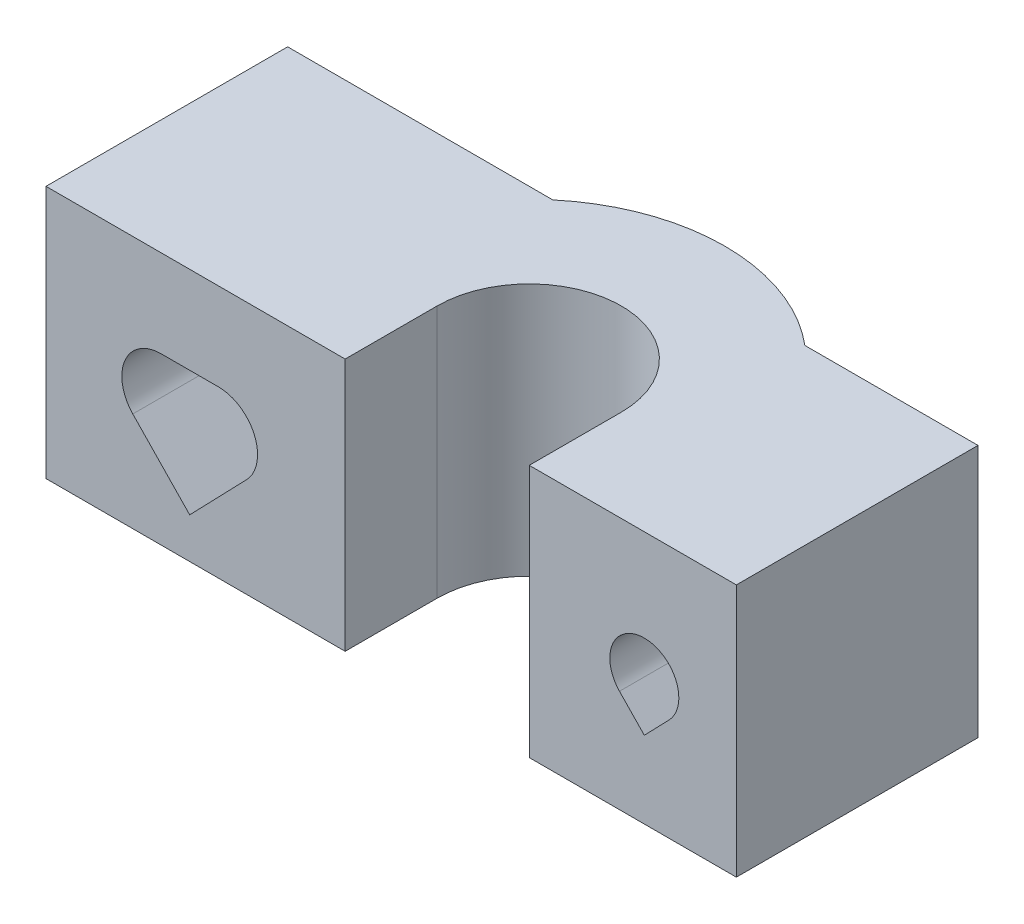
ISO-10303-21;
HEADER;
FILE_DESCRIPTION(('STEP AP214'),'2;1');
FILE_NAME('part.step','',(''),(''),'','','');
FILE_SCHEMA(('AUTOMOTIVE_DESIGN { 1 0 10303 214 1 1 1 1 }'));
ENDSEC;
DATA;
#1=APPLICATION_CONTEXT('core data for automotive mechanical design processes');
#2=APPLICATION_PROTOCOL_DEFINITION('international standard','automotive_design',2000,#1);
#3=PRODUCT_CONTEXT('',#1,'mechanical');
#4=PRODUCT('Part','Part','',(#3));
#5=PRODUCT_RELATED_PRODUCT_CATEGORY('part','',(#4));
#6=PRODUCT_DEFINITION_FORMATION('','',#4);
#7=PRODUCT_DEFINITION_CONTEXT('part definition',#1,'design');
#8=PRODUCT_DEFINITION('design','',#6,#7);
#9=PRODUCT_DEFINITION_SHAPE('','',#8);
#10=(LENGTH_UNIT() NAMED_UNIT(*) SI_UNIT(.MILLI.,.METRE.));
#11=(NAMED_UNIT(*) PLANE_ANGLE_UNIT() SI_UNIT($,.RADIAN.));
#12=(NAMED_UNIT(*) SI_UNIT($,.STERADIAN.) SOLID_ANGLE_UNIT());
#13=UNCERTAINTY_MEASURE_WITH_UNIT(LENGTH_MEASURE(1.E-05),#10,'distance_accuracy_value','');
#14=(GEOMETRIC_REPRESENTATION_CONTEXT(3) GLOBAL_UNCERTAINTY_ASSIGNED_CONTEXT((#13)) GLOBAL_UNIT_ASSIGNED_CONTEXT((#10,
#11,#12)) REPRESENTATION_CONTEXT('',''));
#15=CARTESIAN_POINT('',(0.,0.,0.));
#16=DIRECTION('',(0.,0.,1.));
#17=DIRECTION('',(1.,0.,0.));
#18=AXIS2_PLACEMENT_3D('',#15,#16,#17);
#19=CARTESIAN_POINT('',(9.99999999999999,0.,0.));
#20=DIRECTION('',(0.,0.,1.));
#21=DIRECTION('',(1.,0.,0.));
#22=AXIS2_PLACEMENT_3D('',#19,#20,#21);
#23=PLANE('',#22);
#24=CARTESIAN_POINT('',(36.,5.50000000000001,0.));
#25=DIRECTION('',(0.,0.,1.));
#26=DIRECTION('',(1.,0.,0.));
#27=AXIS2_PLACEMENT_3D('',#24,#25,#26);
#28=CIRCLE('',#27,1.5);
#29=CARTESIAN_POINT('',(37.079009700508,4.45801244431151,0.));
#30=VERTEX_POINT('',#29);
#31=CARTESIAN_POINT('',(34.920990299492,4.45801244431151,0.));
#32=VERTEX_POINT('',#31);
#33=EDGE_CURVE('E194',#30,#32,#28,.T.);
#34=ORIENTED_EDGE('',*,*,#33,.F.);
#35=DIRECTION('',(0.694658370458997,0.719339800338651,0.));
#36=VECTOR('',#35,1.);
#37=CARTESIAN_POINT('',(36.,3.34066519056142,0.));
#38=LINE('',#37,#36);
#39=CARTESIAN_POINT('',(36.,3.34066519056142,0.));
#40=VERTEX_POINT('',#39);
#41=EDGE_CURVE('E204',#40,#30,#38,.T.);
#42=ORIENTED_EDGE('',*,*,#41,.F.);
#43=DIRECTION('',(0.694658370458997,-0.719339800338651,0.));
#44=VECTOR('',#43,1.);
#45=CARTESIAN_POINT('',(34.920990299492,4.45801244431151,0.));
#46=LINE('',#45,#44);
#47=EDGE_CURVE('E201',#32,#40,#46,.T.);
#48=ORIENTED_EDGE('',*,*,#47,.F.);
#49=EDGE_LOOP('',(#34,#42,#48));
#50=FACE_BOUND('',#49,.T.);
#51=DIRECTION('',(0.,-1.,0.));
#52=VECTOR('',#51,1.);
#53=CARTESIAN_POINT('',(31.0000000000001,11.,0.));
#54=LINE('',#53,#52);
#55=CARTESIAN_POINT('',(31.0000000000001,11.,0.));
#56=VERTEX_POINT('',#55);
#57=CARTESIAN_POINT('',(31.0000000000001,0.,0.));
#58=VERTEX_POINT('',#57);
#59=EDGE_CURVE('E225',#56,#58,#54,.T.);
#60=ORIENTED_EDGE('',*,*,#59,.T.);
#61=DIRECTION('',(1.,0.,0.));
#62=VECTOR('',#61,1.);
#63=CARTESIAN_POINT('',(9.99999999999999,0.,0.));
#64=LINE('',#63,#62);
#65=CARTESIAN_POINT('',(40.,0.,0.));
#66=VERTEX_POINT('',#65);
#67=EDGE_CURVE('E244',#58,#66,#64,.T.);
#68=ORIENTED_EDGE('',*,*,#67,.T.);
#69=DIRECTION('',(0.,1.,0.));
#70=VECTOR('',#69,1.);
#71=CARTESIAN_POINT('',(40.,0.,0.));
#72=LINE('',#71,#70);
#73=CARTESIAN_POINT('',(40.,11.,0.));
#74=VERTEX_POINT('',#73);
#75=EDGE_CURVE('E288',#66,#74,#72,.T.);
#76=ORIENTED_EDGE('',*,*,#75,.T.);
#77=DIRECTION('',(1.,0.,0.));
#78=VECTOR('',#77,1.);
#79=CARTESIAN_POINT('',(9.99999999999999,11.,0.));
#80=LINE('',#79,#78);
#81=EDGE_CURVE('E264',#56,#74,#80,.T.);
#82=ORIENTED_EDGE('',*,*,#81,.F.);
#83=EDGE_LOOP('',(#60,#68,#76,#82));
#84=FACE_BOUND('',#83,.T.);
#85=ADVANCED_FACE('F31',(#50,#84),#23,.T.);
#86=CARTESIAN_POINT('',(9.99999999999999,0.,-10.5));
#87=DIRECTION('',(-1.,0.,0.));
#88=DIRECTION('',(0.,0.,1.));
#89=AXIS2_PLACEMENT_3D('',#86,#87,#88);
#90=PLANE('',#89);
#91=DIRECTION('',(0.,0.,1.));
#92=VECTOR('',#91,1.);
#93=CARTESIAN_POINT('',(9.99999999999999,11.,-10.5));
#94=LINE('',#93,#92);
#95=CARTESIAN_POINT('',(9.99999999999999,11.,-10.5));
#96=VERTEX_POINT('',#95);
#97=CARTESIAN_POINT('',(9.99999999999999,11.,0.));
#98=VERTEX_POINT('',#97);
#99=EDGE_CURVE('E234',#96,#98,#94,.T.);
#100=ORIENTED_EDGE('',*,*,#99,.F.);
#101=DIRECTION('',(0.,1.,0.));
#102=VECTOR('',#101,1.);
#103=CARTESIAN_POINT('',(9.99999999999999,0.,-10.5));
#104=LINE('',#103,#102);
#105=CARTESIAN_POINT('',(9.99999999999999,0.,-10.5));
#106=VERTEX_POINT('',#105);
#107=EDGE_CURVE('E279',#106,#96,#104,.T.);
#108=ORIENTED_EDGE('',*,*,#107,.F.);
#109=DIRECTION('',(0.,0.,1.));
#110=VECTOR('',#109,1.);
#111=CARTESIAN_POINT('',(9.99999999999999,0.,-10.5));
#112=LINE('',#111,#110);
#113=CARTESIAN_POINT('',(9.99999999999999,0.,0.));
#114=VERTEX_POINT('',#113);
#115=EDGE_CURVE('E241',#106,#114,#112,.T.);
#116=ORIENTED_EDGE('',*,*,#115,.T.);
#117=DIRECTION('',(0.,1.,0.));
#118=VECTOR('',#117,1.);
#119=CARTESIAN_POINT('',(9.99999999999999,0.,0.));
#120=LINE('',#119,#118);
#121=EDGE_CURVE('E261',#114,#98,#120,.T.);
#122=ORIENTED_EDGE('',*,*,#121,.T.);
#123=EDGE_LOOP('',(#100,#108,#116,#122));
#124=FACE_BOUND('',#123,.T.);
#125=ADVANCED_FACE('F33',(#124),#90,.T.);
#126=CARTESIAN_POINT('',(21.5227744249484,0.,-10.5));
#127=DIRECTION('',(0.,0.,-1.));
#128=DIRECTION('',(-1.,0.,0.));
#129=AXIS2_PLACEMENT_3D('',#126,#127,#128);
#130=PLANE('',#129);
#131=DIRECTION('',(-0.694658370458997,-0.719339800338651,0.));
#132=VECTOR('',#131,1.);
#133=CARTESIAN_POINT('',(18.7171388933383,4.31908077021971,-10.5));
#134=LINE('',#133,#132);
#135=CARTESIAN_POINT('',(18.7171388933383,4.31908077021971,-10.5));
#136=VERTEX_POINT('',#135);
#137=CARTESIAN_POINT('',(16.2442612327626,1.75834099039807,-10.5));
#138=VERTEX_POINT('',#137);
#139=EDGE_CURVE('E46',#136,#138,#134,.T.);
#140=ORIENTED_EDGE('',*,*,#139,.F.);
#141=CARTESIAN_POINT('',(17.4942612327626,5.50000000000001,-10.5));
#142=DIRECTION('',(0.,0.,-1.));
#143=DIRECTION('',(-1.,0.,0.));
#144=AXIS2_PLACEMENT_3D('',#141,#142,#143);
#145=CIRCLE('',#144,1.7);
#146=CARTESIAN_POINT('',(17.4942612327626,7.2,-10.5));
#147=VERTEX_POINT('',#146);
#148=EDGE_CURVE('E174',#147,#136,#145,.T.);
#149=ORIENTED_EDGE('',*,*,#148,.F.);
#150=DIRECTION('',(1.,0.,0.));
#151=VECTOR('',#150,1.);
#152=CARTESIAN_POINT('',(14.9942612327626,7.2,-10.5));
#153=LINE('',#152,#151);
#154=CARTESIAN_POINT('',(14.9942612327626,7.2,-10.5));
#155=VERTEX_POINT('',#154);
#156=EDGE_CURVE('E177',#155,#147,#153,.T.);
#157=ORIENTED_EDGE('',*,*,#156,.F.);
#158=CARTESIAN_POINT('',(14.9942612327626,5.50000000000001,-10.5));
#159=DIRECTION('',(0.,0.,-1.));
#160=DIRECTION('',(-1.,0.,0.));
#161=AXIS2_PLACEMENT_3D('',#158,#159,#160);
#162=CIRCLE('',#161,1.7);
#163=CARTESIAN_POINT('',(13.7713835721869,4.31908077021971,-10.5));
#164=VERTEX_POINT('',#163);
#165=EDGE_CURVE('E187',#164,#155,#162,.T.);
#166=ORIENTED_EDGE('',*,*,#165,.F.);
#167=DIRECTION('',(-0.694658370458997,0.719339800338651,0.));
#168=VECTOR('',#167,1.);
#169=CARTESIAN_POINT('',(16.2442612327626,1.75834099039807,-10.5));
#170=LINE('',#169,#168);
#171=EDGE_CURVE('E185',#138,#164,#170,.T.);
#172=ORIENTED_EDGE('',*,*,#171,.F.);
#173=EDGE_LOOP('',(#140,#149,#157,#166,#172));
#174=FACE_BOUND('',#173,.T.);
#175=DIRECTION('',(-1.,0.,0.));
#176=VECTOR('',#175,1.);
#177=CARTESIAN_POINT('',(21.5227744249484,11.,-10.5));
#178=LINE('',#177,#176);
#179=CARTESIAN_POINT('',(21.5227744249484,11.,-10.5));
#180=VERTEX_POINT('',#179);
#181=EDGE_CURVE('E245',#180,#96,#178,.T.);
#182=ORIENTED_EDGE('',*,*,#181,.F.);
#183=DIRECTION('',(0.,1.,0.));
#184=VECTOR('',#183,1.);
#185=CARTESIAN_POINT('',(21.5227744249484,0.,-10.5));
#186=LINE('',#185,#184);
#187=CARTESIAN_POINT('',(21.5227744249484,0.,-10.5));
#188=VERTEX_POINT('',#187);
#189=EDGE_CURVE('E282',#188,#180,#186,.T.);
#190=ORIENTED_EDGE('',*,*,#189,.F.);
#191=DIRECTION('',(-1.,0.,0.));
#192=VECTOR('',#191,1.);
#193=CARTESIAN_POINT('',(21.5227744249484,0.,-10.5));
#194=LINE('',#193,#192);
#195=EDGE_CURVE('E258',#188,#106,#194,.T.);
#196=ORIENTED_EDGE('',*,*,#195,.T.);
#197=ORIENTED_EDGE('',*,*,#107,.T.);
#198=EDGE_LOOP('',(#182,#190,#196,#197));
#199=FACE_BOUND('',#198,.T.);
#200=ADVANCED_FACE('F346',(#174,#199),#130,.T.);
#201=CARTESIAN_POINT('',(27.0000000000001,0.,-4.));
#202=DIRECTION('',(0.,1.,0.));
#203=DIRECTION('',(0.,0.,1.));
#204=AXIS2_PLACEMENT_3D('',#201,#202,#203);
#205=CYLINDRICAL_SURFACE('',#204,8.50000000000001);
#206=CARTESIAN_POINT('',(27.0000000000001,11.,-4.));
#207=DIRECTION('',(0.,1.,0.));
#208=DIRECTION('',(0.,0.,1.));
#209=AXIS2_PLACEMENT_3D('',#206,#207,#208);
#210=CIRCLE('',#209,8.50000000000001);
#211=CARTESIAN_POINT('',(32.4772255750518,11.,-10.5));
#212=VERTEX_POINT('',#211);
#213=EDGE_CURVE('E274',#212,#180,#210,.T.);
#214=ORIENTED_EDGE('',*,*,#213,.F.);
#215=DIRECTION('',(0.,1.,0.));
#216=VECTOR('',#215,1.);
#217=CARTESIAN_POINT('',(32.4772255750518,0.,-10.5));
#218=LINE('',#217,#216);
#219=CARTESIAN_POINT('',(32.4772255750518,0.,-10.5));
#220=VERTEX_POINT('',#219);
#221=EDGE_CURVE('E284',#220,#212,#218,.T.);
#222=ORIENTED_EDGE('',*,*,#221,.F.);
#223=CARTESIAN_POINT('',(27.0000000000001,0.,-4.));
#224=DIRECTION('',(0.,1.,0.));
#225=DIRECTION('',(0.,0.,1.));
#226=AXIS2_PLACEMENT_3D('',#223,#224,#225);
#227=CIRCLE('',#226,8.50000000000001);
#228=EDGE_CURVE('E255',#220,#188,#227,.T.);
#229=ORIENTED_EDGE('',*,*,#228,.T.);
#230=ORIENTED_EDGE('',*,*,#189,.T.);
#231=EDGE_LOOP('',(#214,#222,#229,#230));
#232=FACE_BOUND('',#231,.T.);
#233=ADVANCED_FACE('F349',(#232),#205,.T.);
#234=CARTESIAN_POINT('',(40.,0.,-10.5));
#235=DIRECTION('',(0.,0.,-1.));
#236=DIRECTION('',(-1.,0.,0.));
#237=AXIS2_PLACEMENT_3D('',#234,#235,#236);
#238=PLANE('',#237);
#239=CARTESIAN_POINT('',(36.,5.50000000000001,-10.5));
#240=DIRECTION('',(0.,0.,-1.));
#241=DIRECTION('',(-1.,0.,0.));
#242=AXIS2_PLACEMENT_3D('',#239,#240,#241);
#243=CIRCLE('',#242,1.5);
#244=CARTESIAN_POINT('',(34.920990299492,4.45801244431151,-10.5));
#245=VERTEX_POINT('',#244);
#246=CARTESIAN_POINT('',(37.079009700508,4.45801244431151,-10.5));
#247=VERTEX_POINT('',#246);
#248=EDGE_CURVE('E11',#245,#247,#243,.T.);
#249=ORIENTED_EDGE('',*,*,#248,.F.);
#250=DIRECTION('',(-0.694658370458997,0.719339800338651,0.));
#251=VECTOR('',#250,1.);
#252=CARTESIAN_POINT('',(39.5995160803895,-0.386742825658563,-10.5));
#253=LINE('',#252,#251);
#254=CARTESIAN_POINT('',(36.,3.34066519056142,-10.5));
#255=VERTEX_POINT('',#254);
#256=EDGE_CURVE('E281',#255,#245,#253,.T.);
#257=ORIENTED_EDGE('',*,*,#256,.F.);
#258=DIRECTION('',(-0.694658370458997,-0.719339800338651,0.));
#259=VECTOR('',#258,1.);
#260=CARTESIAN_POINT('',(36.2608859328005,3.61082048241782,-10.5));
#261=LINE('',#260,#259);
#262=EDGE_CURVE('E39',#247,#255,#261,.T.);
#263=ORIENTED_EDGE('',*,*,#262,.F.);
#264=EDGE_LOOP('',(#249,#257,#263));
#265=FACE_BOUND('',#264,.T.);
#266=DIRECTION('',(-1.,0.,0.));
#267=VECTOR('',#266,1.);
#268=CARTESIAN_POINT('',(40.,11.,-10.5));
#269=LINE('',#268,#267);
#270=CARTESIAN_POINT('',(40.,11.,-10.5));
#271=VERTEX_POINT('',#270);
#272=EDGE_CURVE('E271',#271,#212,#269,.T.);
#273=ORIENTED_EDGE('',*,*,#272,.F.);
#274=DIRECTION('',(0.,1.,0.));
#275=VECTOR('',#274,1.);
#276=CARTESIAN_POINT('',(40.,0.,-10.5));
#277=LINE('',#276,#275);
#278=CARTESIAN_POINT('',(40.,0.,-10.5));
#279=VERTEX_POINT('',#278);
#280=EDGE_CURVE('E286',#279,#271,#277,.T.);
#281=ORIENTED_EDGE('',*,*,#280,.F.);
#282=DIRECTION('',(-1.,0.,0.));
#283=VECTOR('',#282,1.);
#284=CARTESIAN_POINT('',(40.,0.,-10.5));
#285=LINE('',#284,#283);
#286=EDGE_CURVE('E252',#279,#220,#285,.T.);
#287=ORIENTED_EDGE('',*,*,#286,.T.);
#288=ORIENTED_EDGE('',*,*,#221,.T.);
#289=EDGE_LOOP('',(#273,#281,#287,#288));
#290=FACE_BOUND('',#289,.T.);
#291=ADVANCED_FACE('F300',(#265,#290),#238,.T.);
#292=CARTESIAN_POINT('',(40.,0.,0.));
#293=DIRECTION('',(1.,0.,0.));
#294=DIRECTION('',(0.,0.,-1.));
#295=AXIS2_PLACEMENT_3D('',#292,#293,#294);
#296=PLANE('',#295);
#297=DIRECTION('',(0.,0.,-1.));
#298=VECTOR('',#297,1.);
#299=CARTESIAN_POINT('',(40.,11.,0.));
#300=LINE('',#299,#298);
#301=EDGE_CURVE('E268',#74,#271,#300,.T.);
#302=ORIENTED_EDGE('',*,*,#301,.F.);
#303=ORIENTED_EDGE('',*,*,#75,.F.);
#304=DIRECTION('',(0.,0.,-1.));
#305=VECTOR('',#304,1.);
#306=CARTESIAN_POINT('',(40.,0.,0.));
#307=LINE('',#306,#305);
#308=EDGE_CURVE('E249',#66,#279,#307,.T.);
#309=ORIENTED_EDGE('',*,*,#308,.T.);
#310=ORIENTED_EDGE('',*,*,#280,.T.);
#311=EDGE_LOOP('',(#302,#303,#309,#310));
#312=FACE_BOUND('',#311,.T.);
#313=ADVANCED_FACE('F327',(#312),#296,.T.);
#314=DIRECTION('',(-0.694658370458997,-0.719339800338651,0.));
#315=VECTOR('',#314,1.);
#316=CARTESIAN_POINT('',(18.7171388933383,4.31908077021971,0.));
#317=LINE('',#316,#315);
#318=CARTESIAN_POINT('',(18.7171388933383,4.31908077021971,0.));
#319=VERTEX_POINT('',#318);
#320=CARTESIAN_POINT('',(16.2442612327626,1.75834099039807,0.));
#321=VERTEX_POINT('',#320);
#322=EDGE_CURVE('E157',#319,#321,#317,.T.);
#323=ORIENTED_EDGE('',*,*,#322,.T.);
#324=DIRECTION('',(-0.694658370458997,0.719339800338651,0.));
#325=VECTOR('',#324,1.);
#326=CARTESIAN_POINT('',(16.2442612327626,1.75834099039807,0.));
#327=LINE('',#326,#325);
#328=CARTESIAN_POINT('',(13.7713835721869,4.31908077021971,0.));
#329=VERTEX_POINT('',#328);
#330=EDGE_CURVE('E166',#321,#329,#327,.T.);
#331=ORIENTED_EDGE('',*,*,#330,.T.);
#332=CARTESIAN_POINT('',(14.9942612327626,5.50000000000001,0.));
#333=DIRECTION('',(0.,0.,-1.));
#334=DIRECTION('',(-1.,0.,0.));
#335=AXIS2_PLACEMENT_3D('',#332,#333,#334);
#336=CIRCLE('',#335,1.7);
#337=CARTESIAN_POINT('',(14.9942612327626,7.2,0.));
#338=VERTEX_POINT('',#337);
#339=EDGE_CURVE('E54',#329,#338,#336,.T.);
#340=ORIENTED_EDGE('',*,*,#339,.T.);
#341=DIRECTION('',(1.,0.,0.));
#342=VECTOR('',#341,1.);
#343=CARTESIAN_POINT('',(14.9942612327626,7.2,0.));
#344=LINE('',#343,#342);
#345=CARTESIAN_POINT('',(17.4942612327626,7.2,0.));
#346=VERTEX_POINT('',#345);
#347=EDGE_CURVE('E181',#338,#346,#344,.T.);
#348=ORIENTED_EDGE('',*,*,#347,.T.);
#349=CARTESIAN_POINT('',(17.4942612327626,5.50000000000001,0.));
#350=DIRECTION('',(0.,0.,-1.));
#351=DIRECTION('',(-1.,0.,0.));
#352=AXIS2_PLACEMENT_3D('',#349,#350,#351);
#353=CIRCLE('',#352,1.7);
#354=EDGE_CURVE('E163',#346,#319,#353,.T.);
#355=ORIENTED_EDGE('',*,*,#354,.T.);
#356=EDGE_LOOP('',(#323,#331,#340,#348,#355));
#357=FACE_BOUND('',#356,.T.);
#358=DIRECTION('',(0.,-1.,0.));
#359=VECTOR('',#358,1.);
#360=CARTESIAN_POINT('',(23.0000000000001,11.,0.));
#361=LINE('',#360,#359);
#362=CARTESIAN_POINT('',(23.0000000000001,11.,0.));
#363=VERTEX_POINT('',#362);
#364=CARTESIAN_POINT('',(23.0000000000001,0.,0.));
#365=VERTEX_POINT('',#364);
#366=EDGE_CURVE('E237',#363,#365,#361,.T.);
#367=ORIENTED_EDGE('',*,*,#366,.F.);
#368=EDGE_CURVE('E265',#98,#363,#80,.T.);
#369=ORIENTED_EDGE('',*,*,#368,.F.);
#370=ORIENTED_EDGE('',*,*,#121,.F.);
#371=EDGE_CURVE('E246',#114,#365,#64,.T.);
#372=ORIENTED_EDGE('',*,*,#371,.T.);
#373=EDGE_LOOP('',(#367,#369,#370,#372));
#374=FACE_BOUND('',#373,.T.);
#375=ADVANCED_FACE('F170',(#357,#374),#23,.T.);
#376=CARTESIAN_POINT('',(27.0000000000001,0.,-4.));
#377=DIRECTION('',(0.,1.,0.));
#378=DIRECTION('',(0.,0.,1.));
#379=AXIS2_PLACEMENT_3D('',#376,#377,#378);
#380=PLANE('',#379);
#381=ORIENTED_EDGE('',*,*,#67,.F.);
#382=DIRECTION('',(0.,0.,1.));
#383=VECTOR('',#382,1.);
#384=CARTESIAN_POINT('',(31.0000000000001,0.,-4.));
#385=LINE('',#384,#383);
#386=CARTESIAN_POINT('',(31.0000000000001,0.,-4.));
#387=VERTEX_POINT('',#386);
#388=EDGE_CURVE('E210',#387,#58,#385,.T.);
#389=ORIENTED_EDGE('',*,*,#388,.F.);
#390=CARTESIAN_POINT('',(27.0000000000001,0.,-4.));
#391=DIRECTION('',(0.,-1.,0.));
#392=DIRECTION('',(0.,0.,-1.));
#393=AXIS2_PLACEMENT_3D('',#390,#391,#392);
#394=CIRCLE('',#393,4.);
#395=CARTESIAN_POINT('',(23.0000000000001,0.,-4.));
#396=VERTEX_POINT('',#395);
#397=EDGE_CURVE('E219',#396,#387,#394,.T.);
#398=ORIENTED_EDGE('',*,*,#397,.F.);
#399=DIRECTION('',(0.,0.,-1.));
#400=VECTOR('',#399,1.);
#401=CARTESIAN_POINT('',(23.0000000000001,0.,0.));
#402=LINE('',#401,#400);
#403=EDGE_CURVE('E227',#365,#396,#402,.T.);
#404=ORIENTED_EDGE('',*,*,#403,.F.);
#405=ORIENTED_EDGE('',*,*,#371,.F.);
#406=ORIENTED_EDGE('',*,*,#115,.F.);
#407=ORIENTED_EDGE('',*,*,#195,.F.);
#408=ORIENTED_EDGE('',*,*,#228,.F.);
#409=ORIENTED_EDGE('',*,*,#286,.F.);
#410=ORIENTED_EDGE('',*,*,#308,.F.);
#411=EDGE_LOOP('',(#381,#389,#398,#404,#405,#406,#407,#408,#409,#410));
#412=FACE_BOUND('',#411,.T.);
#413=ADVANCED_FACE('F321',(#412),#380,.F.);
#414=CARTESIAN_POINT('',(27.0000000000001,11.,-4.));
#415=DIRECTION('',(0.,1.,0.));
#416=DIRECTION('',(0.,0.,1.));
#417=AXIS2_PLACEMENT_3D('',#414,#415,#416);
#418=PLANE('',#417);
#419=DIRECTION('',(0.,0.,1.));
#420=VECTOR('',#419,1.);
#421=CARTESIAN_POINT('',(31.0000000000001,11.,-4.));
#422=LINE('',#421,#420);
#423=CARTESIAN_POINT('',(31.0000000000001,11.,-4.));
#424=VERTEX_POINT('',#423);
#425=EDGE_CURVE('E215',#424,#56,#422,.T.);
#426=ORIENTED_EDGE('',*,*,#425,.T.);
#427=ORIENTED_EDGE('',*,*,#81,.T.);
#428=ORIENTED_EDGE('',*,*,#301,.T.);
#429=ORIENTED_EDGE('',*,*,#272,.T.);
#430=ORIENTED_EDGE('',*,*,#213,.T.);
#431=ORIENTED_EDGE('',*,*,#181,.T.);
#432=ORIENTED_EDGE('',*,*,#99,.T.);
#433=ORIENTED_EDGE('',*,*,#368,.T.);
#434=DIRECTION('',(0.,0.,-1.));
#435=VECTOR('',#434,1.);
#436=CARTESIAN_POINT('',(23.0000000000001,11.,0.));
#437=LINE('',#436,#435);
#438=CARTESIAN_POINT('',(23.0000000000001,11.,-4.));
#439=VERTEX_POINT('',#438);
#440=EDGE_CURVE('E218',#363,#439,#437,.T.);
#441=ORIENTED_EDGE('',*,*,#440,.T.);
#442=CARTESIAN_POINT('',(27.0000000000001,11.,-4.));
#443=DIRECTION('',(0.,-1.,0.));
#444=DIRECTION('',(0.,0.,-1.));
#445=AXIS2_PLACEMENT_3D('',#442,#443,#444);
#446=CIRCLE('',#445,4.);
#447=EDGE_CURVE('E222',#439,#424,#446,.T.);
#448=ORIENTED_EDGE('',*,*,#447,.T.);
#449=EDGE_LOOP('',(#426,#427,#428,#429,#430,#431,#432,#433,#441,#448));
#450=FACE_BOUND('',#449,.T.);
#451=ADVANCED_FACE('F330',(#450),#418,.T.);
#452=CARTESIAN_POINT('',(31.0000000000001,11.,-4.));
#453=DIRECTION('',(1.,0.,0.));
#454=DIRECTION('',(0.,0.,-1.));
#455=AXIS2_PLACEMENT_3D('',#452,#453,#454);
#456=PLANE('',#455);
#457=ORIENTED_EDGE('',*,*,#388,.T.);
#458=ORIENTED_EDGE('',*,*,#59,.F.);
#459=ORIENTED_EDGE('',*,*,#425,.F.);
#460=DIRECTION('',(0.,-1.,0.));
#461=VECTOR('',#460,1.);
#462=CARTESIAN_POINT('',(31.0000000000001,11.,-4.));
#463=LINE('',#462,#461);
#464=EDGE_CURVE('E232',#424,#387,#463,.T.);
#465=ORIENTED_EDGE('',*,*,#464,.T.);
#466=EDGE_LOOP('',(#457,#458,#459,#465));
#467=FACE_BOUND('',#466,.T.);
#468=ADVANCED_FACE('F331',(#467),#456,.F.);
#469=CARTESIAN_POINT('',(27.0000000000001,11.,-4.));
#470=DIRECTION('',(0.,-1.,0.));
#471=DIRECTION('',(0.,0.,-1.));
#472=AXIS2_PLACEMENT_3D('',#469,#470,#471);
#473=CYLINDRICAL_SURFACE('',#472,4.);
#474=ORIENTED_EDGE('',*,*,#397,.T.);
#475=ORIENTED_EDGE('',*,*,#464,.F.);
#476=ORIENTED_EDGE('',*,*,#447,.F.);
#477=DIRECTION('',(0.,-1.,0.));
#478=VECTOR('',#477,1.);
#479=CARTESIAN_POINT('',(23.0000000000001,11.,-4.));
#480=LINE('',#479,#478);
#481=EDGE_CURVE('E235',#439,#396,#480,.T.);
#482=ORIENTED_EDGE('',*,*,#481,.T.);
#483=EDGE_LOOP('',(#474,#475,#476,#482));
#484=FACE_BOUND('',#483,.T.);
#485=ADVANCED_FACE('F333',(#484),#473,.F.);
#486=CARTESIAN_POINT('',(23.0000000000001,11.,0.));
#487=DIRECTION('',(-1.,0.,0.));
#488=DIRECTION('',(0.,0.,1.));
#489=AXIS2_PLACEMENT_3D('',#486,#487,#488);
#490=PLANE('',#489);
#491=ORIENTED_EDGE('',*,*,#403,.T.);
#492=ORIENTED_EDGE('',*,*,#481,.F.);
#493=ORIENTED_EDGE('',*,*,#440,.F.);
#494=ORIENTED_EDGE('',*,*,#366,.T.);
#495=EDGE_LOOP('',(#491,#492,#493,#494));
#496=FACE_BOUND('',#495,.T.);
#497=ADVANCED_FACE('F350',(#496),#490,.F.);
#498=CARTESIAN_POINT('',(36.,5.50000000000001,-12.5));
#499=DIRECTION('',(0.,0.,1.));
#500=DIRECTION('',(1.,0.,0.));
#501=AXIS2_PLACEMENT_3D('',#498,#499,#500);
#502=CYLINDRICAL_SURFACE('',#501,1.5);
#503=ORIENTED_EDGE('',*,*,#248,.T.);
#504=DIRECTION('',(0.,0.,1.));
#505=VECTOR('',#504,1.);
#506=CARTESIAN_POINT('',(37.079009700508,4.45801244431151,-12.5));
#507=LINE('',#506,#505);
#508=EDGE_CURVE('E208',#247,#30,#507,.T.);
#509=ORIENTED_EDGE('',*,*,#508,.T.);
#510=ORIENTED_EDGE('',*,*,#33,.T.);
#511=DIRECTION('',(0.,0.,1.));
#512=VECTOR('',#511,1.);
#513=CARTESIAN_POINT('',(34.920990299492,4.45801244431151,-12.5));
#514=LINE('',#513,#512);
#515=EDGE_CURVE('E207',#245,#32,#514,.T.);
#516=ORIENTED_EDGE('',*,*,#515,.F.);
#517=EDGE_LOOP('',(#503,#509,#510,#516));
#518=FACE_BOUND('',#517,.T.);
#519=ADVANCED_FACE('F307',(#518),#502,.F.);
#520=CARTESIAN_POINT('',(36.,3.34066519056142,-12.5));
#521=DIRECTION('',(0.719339800338651,-0.694658370458997,0.));
#522=DIRECTION('',(0.694658370458997,0.719339800338651,0.));
#523=AXIS2_PLACEMENT_3D('',#520,#521,#522);
#524=PLANE('',#523);
#525=ORIENTED_EDGE('',*,*,#262,.T.);
#526=DIRECTION('',(0.,0.,1.));
#527=VECTOR('',#526,1.);
#528=CARTESIAN_POINT('',(36.,3.34066519056142,-12.5));
#529=LINE('',#528,#527);
#530=EDGE_CURVE('E211',#255,#40,#529,.T.);
#531=ORIENTED_EDGE('',*,*,#530,.T.);
#532=ORIENTED_EDGE('',*,*,#41,.T.);
#533=ORIENTED_EDGE('',*,*,#508,.F.);
#534=EDGE_LOOP('',(#525,#531,#532,#533));
#535=FACE_BOUND('',#534,.T.);
#536=ADVANCED_FACE('F297',(#535),#524,.F.);
#537=CARTESIAN_POINT('',(34.920990299492,4.45801244431151,-12.5));
#538=DIRECTION('',(-0.719339800338651,-0.694658370458997,0.));
#539=DIRECTION('',(0.694658370458997,-0.719339800338651,0.));
#540=AXIS2_PLACEMENT_3D('',#537,#538,#539);
#541=PLANE('',#540);
#542=ORIENTED_EDGE('',*,*,#256,.T.);
#543=ORIENTED_EDGE('',*,*,#515,.T.);
#544=ORIENTED_EDGE('',*,*,#47,.T.);
#545=ORIENTED_EDGE('',*,*,#530,.F.);
#546=EDGE_LOOP('',(#542,#543,#544,#545));
#547=FACE_BOUND('',#546,.T.);
#548=ADVANCED_FACE('F304',(#547),#541,.F.);
#549=CARTESIAN_POINT('',(18.7171388933383,4.31908077021971,0.));
#550=DIRECTION('',(0.719339800338651,-0.694658370458997,0.));
#551=DIRECTION('',(0.694658370458997,0.719339800338651,0.));
#552=AXIS2_PLACEMENT_3D('',#549,#550,#551);
#553=PLANE('',#552);
#554=ORIENTED_EDGE('',*,*,#139,.T.);
#555=DIRECTION('',(0.,0.,-1.));
#556=VECTOR('',#555,1.);
#557=CARTESIAN_POINT('',(16.2442612327626,1.75834099039807,0.));
#558=LINE('',#557,#556);
#559=EDGE_CURVE('E153',#321,#138,#558,.T.);
#560=ORIENTED_EDGE('',*,*,#559,.F.);
#561=ORIENTED_EDGE('',*,*,#322,.F.);
#562=DIRECTION('',(0.,0.,-1.));
#563=VECTOR('',#562,1.);
#564=CARTESIAN_POINT('',(18.7171388933383,4.31908077021971,0.));
#565=LINE('',#564,#563);
#566=EDGE_CURVE('E192',#319,#136,#565,.T.);
#567=ORIENTED_EDGE('',*,*,#566,.T.);
#568=EDGE_LOOP('',(#554,#560,#561,#567));
#569=FACE_BOUND('',#568,.T.);
#570=ADVANCED_FACE('F155',(#569),#553,.F.);
#571=CARTESIAN_POINT('',(17.4942612327626,5.50000000000001,0.));
#572=DIRECTION('',(0.,0.,-1.));
#573=DIRECTION('',(-1.,0.,0.));
#574=AXIS2_PLACEMENT_3D('',#571,#572,#573);
#575=CYLINDRICAL_SURFACE('',#574,1.7);
#576=ORIENTED_EDGE('',*,*,#148,.T.);
#577=ORIENTED_EDGE('',*,*,#566,.F.);
#578=ORIENTED_EDGE('',*,*,#354,.F.);
#579=DIRECTION('',(0.,0.,-1.));
#580=VECTOR('',#579,1.);
#581=CARTESIAN_POINT('',(17.4942612327626,7.2,0.));
#582=LINE('',#581,#580);
#583=EDGE_CURVE('E195',#346,#147,#582,.T.);
#584=ORIENTED_EDGE('',*,*,#583,.T.);
#585=EDGE_LOOP('',(#576,#577,#578,#584));
#586=FACE_BOUND('',#585,.T.);
#587=ADVANCED_FACE('F471',(#586),#575,.F.);
#588=CARTESIAN_POINT('',(14.9942612327626,7.2,0.));
#589=DIRECTION('',(0.,1.,0.));
#590=DIRECTION('',(0.,0.,1.));
#591=AXIS2_PLACEMENT_3D('',#588,#589,#590);
#592=PLANE('',#591);
#593=ORIENTED_EDGE('',*,*,#156,.T.);
#594=ORIENTED_EDGE('',*,*,#583,.F.);
#595=ORIENTED_EDGE('',*,*,#347,.F.);
#596=DIRECTION('',(0.,0.,-1.));
#597=VECTOR('',#596,1.);
#598=CARTESIAN_POINT('',(14.9942612327626,7.2,0.));
#599=LINE('',#598,#597);
#600=EDGE_CURVE('E197',#338,#155,#599,.T.);
#601=ORIENTED_EDGE('',*,*,#600,.T.);
#602=EDGE_LOOP('',(#593,#594,#595,#601));
#603=FACE_BOUND('',#602,.T.);
#604=ADVANCED_FACE('F477',(#603),#592,.F.);
#605=CARTESIAN_POINT('',(14.9942612327626,5.50000000000001,0.));
#606=DIRECTION('',(0.,0.,-1.));
#607=DIRECTION('',(-1.,0.,0.));
#608=AXIS2_PLACEMENT_3D('',#605,#606,#607);
#609=CYLINDRICAL_SURFACE('',#608,1.7);
#610=ORIENTED_EDGE('',*,*,#165,.T.);
#611=ORIENTED_EDGE('',*,*,#600,.F.);
#612=ORIENTED_EDGE('',*,*,#339,.F.);
#613=DIRECTION('',(0.,0.,-1.));
#614=VECTOR('',#613,1.);
#615=CARTESIAN_POINT('',(13.7713835721869,4.31908077021971,0.));
#616=LINE('',#615,#614);
#617=EDGE_CURVE('E162',#329,#164,#616,.T.);
#618=ORIENTED_EDGE('',*,*,#617,.T.);
#619=EDGE_LOOP('',(#610,#611,#612,#618));
#620=FACE_BOUND('',#619,.T.);
#621=ADVANCED_FACE('F485',(#620),#609,.F.);
#622=CARTESIAN_POINT('',(16.2442612327626,1.75834099039807,0.));
#623=DIRECTION('',(-0.719339800338651,-0.694658370458997,0.));
#624=DIRECTION('',(0.694658370458997,-0.719339800338651,0.));
#625=AXIS2_PLACEMENT_3D('',#622,#623,#624);
#626=PLANE('',#625);
#627=ORIENTED_EDGE('',*,*,#171,.T.);
#628=ORIENTED_EDGE('',*,*,#617,.F.);
#629=ORIENTED_EDGE('',*,*,#330,.F.);
#630=ORIENTED_EDGE('',*,*,#559,.T.);
#631=EDGE_LOOP('',(#627,#628,#629,#630));
#632=FACE_BOUND('',#631,.T.);
#633=ADVANCED_FACE('F167',(#632),#626,.F.);
#634=CLOSED_SHELL('',(#85,#125,#200,#233,#291,#313,#375,#413,#451,#468,#485,#497,#519,#536,#548,
#570,#587,#604,#621,#633));
#635=MANIFOLD_SOLID_BREP('B2',#634);
#636=ADVANCED_BREP_SHAPE_REPRESENTATION('',(#18,#635),#14);
#637=SHAPE_DEFINITION_REPRESENTATION(#9,#636);
ENDSEC;
END-ISO-10303-21;
